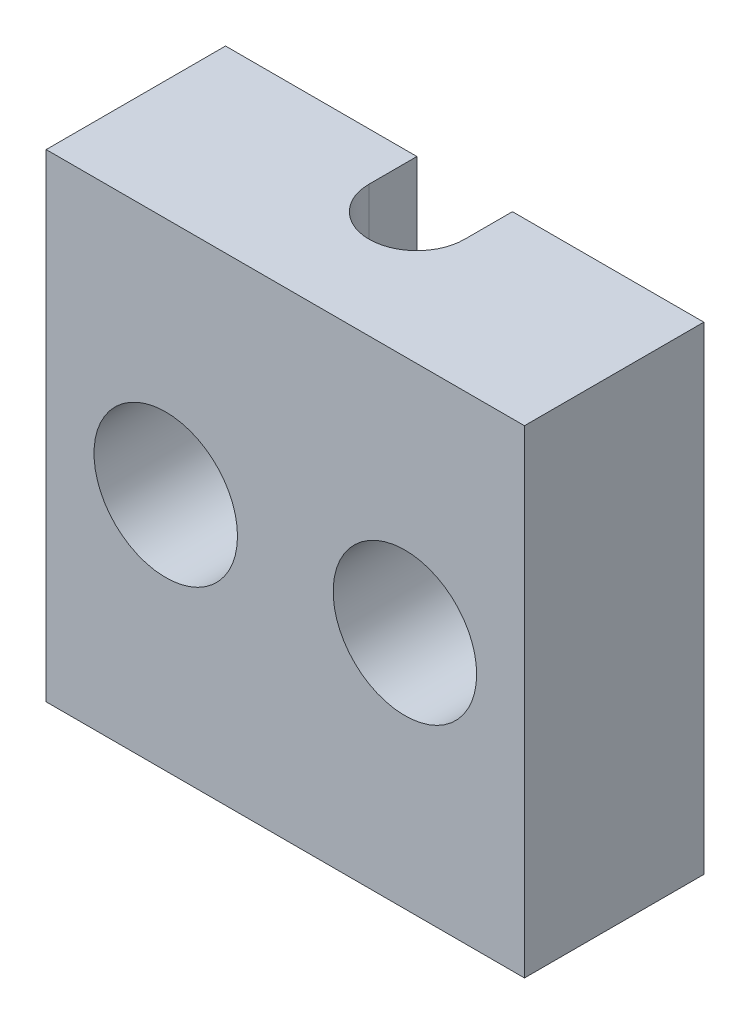
ISO-10303-21;
HEADER;
FILE_DESCRIPTION(('STEP AP214'),'2;1');
FILE_NAME('part.step','',(''),(''),'','','');
FILE_SCHEMA(('AUTOMOTIVE_DESIGN { 1 0 10303 214 1 1 1 1 }'));
ENDSEC;
DATA;
#1=APPLICATION_CONTEXT('core data for automotive mechanical design processes');
#2=APPLICATION_PROTOCOL_DEFINITION('international standard','automotive_design',2000,#1);
#3=PRODUCT_CONTEXT('',#1,'mechanical');
#4=PRODUCT('Part','Part','',(#3));
#5=PRODUCT_RELATED_PRODUCT_CATEGORY('part','',(#4));
#6=PRODUCT_DEFINITION_FORMATION('','',#4);
#7=PRODUCT_DEFINITION_CONTEXT('part definition',#1,'design');
#8=PRODUCT_DEFINITION('design','',#6,#7);
#9=PRODUCT_DEFINITION_SHAPE('','',#8);
#10=(LENGTH_UNIT() NAMED_UNIT(*) SI_UNIT(.MILLI.,.METRE.));
#11=(NAMED_UNIT(*) PLANE_ANGLE_UNIT() SI_UNIT($,.RADIAN.));
#12=(NAMED_UNIT(*) SI_UNIT($,.STERADIAN.) SOLID_ANGLE_UNIT());
#13=UNCERTAINTY_MEASURE_WITH_UNIT(LENGTH_MEASURE(1.E-05),#10,'distance_accuracy_value','');
#14=(GEOMETRIC_REPRESENTATION_CONTEXT(3) GLOBAL_UNCERTAINTY_ASSIGNED_CONTEXT((#13)) GLOBAL_UNIT_ASSIGNED_CONTEXT((#10,
#11,#12)) REPRESENTATION_CONTEXT('',''));
#15=CARTESIAN_POINT('',(0.,0.,0.));
#16=DIRECTION('',(0.,0.,1.));
#17=DIRECTION('',(1.,0.,0.));
#18=AXIS2_PLACEMENT_3D('',#15,#16,#17);
#19=CARTESIAN_POINT('',(-5.08,5.08,3.81));
#20=DIRECTION('',(0.,-1.,0.));
#21=DIRECTION('',(0.,0.,-1.));
#22=AXIS2_PLACEMENT_3D('',#19,#20,#21);
#23=PLANE('',#22);
#24=DIRECTION('',(0.,0.,1.));
#25=VECTOR('',#24,1.);
#26=CARTESIAN_POINT('',(1.01473,5.08,0.));
#27=LINE('',#26,#25);
#28=CARTESIAN_POINT('',(1.01473,5.08,0.));
#29=VERTEX_POINT('',#28);
#30=CARTESIAN_POINT('',(1.01473,5.08,1.016));
#31=VERTEX_POINT('',#30);
#32=EDGE_CURVE('E137',#29,#31,#27,.T.);
#33=ORIENTED_EDGE('',*,*,#32,.T.);
#34=CARTESIAN_POINT('',(0.,5.08,1.016));
#35=DIRECTION('',(0.,-1.,0.));
#36=DIRECTION('',(0.,0.,-1.));
#37=AXIS2_PLACEMENT_3D('',#34,#35,#36);
#38=CIRCLE('',#37,1.01473);
#39=CARTESIAN_POINT('',(-1.01473,5.08,1.016));
#40=VERTEX_POINT('',#39);
#41=EDGE_CURVE('E114',#40,#31,#38,.F.);
#42=ORIENTED_EDGE('',*,*,#41,.F.);
#43=DIRECTION('',(0.,0.,1.));
#44=VECTOR('',#43,1.);
#45=CARTESIAN_POINT('',(-1.01473,5.08,0.));
#46=LINE('',#45,#44);
#47=CARTESIAN_POINT('',(-1.01473,5.08,0.));
#48=VERTEX_POINT('',#47);
#49=EDGE_CURVE('E131',#48,#40,#46,.T.);
#50=ORIENTED_EDGE('',*,*,#49,.F.);
#51=DIRECTION('',(-1.,0.,0.));
#52=VECTOR('',#51,1.);
#53=CARTESIAN_POINT('',(-5.08,5.08,0.));
#54=LINE('',#53,#52);
#55=CARTESIAN_POINT('',(-5.08,5.08,0.));
#56=VERTEX_POINT('',#55);
#57=EDGE_CURVE('E160',#48,#56,#54,.T.);
#58=ORIENTED_EDGE('',*,*,#57,.T.);
#59=DIRECTION('',(0.,0.,-1.));
#60=VECTOR('',#59,1.);
#61=CARTESIAN_POINT('',(-5.08,5.08,3.81));
#62=LINE('',#61,#60);
#63=CARTESIAN_POINT('',(-5.08,5.08,3.81));
#64=VERTEX_POINT('',#63);
#65=EDGE_CURVE('E41',#64,#56,#62,.T.);
#66=ORIENTED_EDGE('',*,*,#65,.F.);
#67=DIRECTION('',(-1.,0.,0.));
#68=VECTOR('',#67,1.);
#69=CARTESIAN_POINT('',(-5.08,5.08,3.81));
#70=LINE('',#69,#68);
#71=CARTESIAN_POINT('',(5.08,5.08,3.81));
#72=VERTEX_POINT('',#71);
#73=EDGE_CURVE('E85',#72,#64,#70,.T.);
#74=ORIENTED_EDGE('',*,*,#73,.F.);
#75=DIRECTION('',(0.,0.,-1.));
#76=VECTOR('',#75,1.);
#77=CARTESIAN_POINT('',(5.08,5.08,3.81));
#78=LINE('',#77,#76);
#79=CARTESIAN_POINT('',(5.08,5.08,0.));
#80=VERTEX_POINT('',#79);
#81=EDGE_CURVE('E11',#72,#80,#78,.T.);
#82=ORIENTED_EDGE('',*,*,#81,.T.);
#83=EDGE_CURVE('E161',#80,#29,#54,.T.);
#84=ORIENTED_EDGE('',*,*,#83,.T.);
#85=EDGE_LOOP('',(#33,#42,#50,#58,#66,#74,#82,#84));
#86=FACE_BOUND('',#85,.T.);
#87=ADVANCED_FACE('F33',(#86),#23,.F.);
#88=CARTESIAN_POINT('',(-5.08,-5.08,3.81));
#89=DIRECTION('',(0.,1.,0.));
#90=DIRECTION('',(0.,0.,1.));
#91=AXIS2_PLACEMENT_3D('',#88,#89,#90);
#92=PLANE('',#91);
#93=DIRECTION('',(0.,0.,-1.));
#94=VECTOR('',#93,1.);
#95=CARTESIAN_POINT('',(1.01473,-5.08,0.));
#96=LINE('',#95,#94);
#97=CARTESIAN_POINT('',(1.01473,-5.08,1.016));
#98=VERTEX_POINT('',#97);
#99=CARTESIAN_POINT('',(1.01473,-5.08,0.));
#100=VERTEX_POINT('',#99);
#101=EDGE_CURVE('E119',#98,#100,#96,.T.);
#102=ORIENTED_EDGE('',*,*,#101,.T.);
#103=DIRECTION('',(1.,0.,0.));
#104=VECTOR('',#103,1.);
#105=CARTESIAN_POINT('',(-5.08,-5.08,0.));
#106=LINE('',#105,#104);
#107=CARTESIAN_POINT('',(5.08,-5.08,0.));
#108=VERTEX_POINT('',#107);
#109=EDGE_CURVE('E78',#100,#108,#106,.T.);
#110=ORIENTED_EDGE('',*,*,#109,.T.);
#111=DIRECTION('',(0.,0.,-1.));
#112=VECTOR('',#111,1.);
#113=CARTESIAN_POINT('',(5.08,-5.08,3.81));
#114=LINE('',#113,#112);
#115=CARTESIAN_POINT('',(5.08,-5.08,3.81));
#116=VERTEX_POINT('',#115);
#117=EDGE_CURVE('E157',#116,#108,#114,.T.);
#118=ORIENTED_EDGE('',*,*,#117,.F.);
#119=DIRECTION('',(1.,0.,0.));
#120=VECTOR('',#119,1.);
#121=CARTESIAN_POINT('',(-5.08,-5.08,3.81));
#122=LINE('',#121,#120);
#123=CARTESIAN_POINT('',(-5.08,-5.08,3.81));
#124=VERTEX_POINT('',#123);
#125=EDGE_CURVE('E57',#124,#116,#122,.T.);
#126=ORIENTED_EDGE('',*,*,#125,.F.);
#127=DIRECTION('',(0.,0.,-1.));
#128=VECTOR('',#127,1.);
#129=CARTESIAN_POINT('',(-5.08,-5.08,3.81));
#130=LINE('',#129,#128);
#131=CARTESIAN_POINT('',(-5.08,-5.08,0.));
#132=VERTEX_POINT('',#131);
#133=EDGE_CURVE('E168',#124,#132,#130,.T.);
#134=ORIENTED_EDGE('',*,*,#133,.T.);
#135=CARTESIAN_POINT('',(-1.01473,-5.08,0.));
#136=VERTEX_POINT('',#135);
#137=EDGE_CURVE('E152',#132,#136,#106,.T.);
#138=ORIENTED_EDGE('',*,*,#137,.T.);
#139=DIRECTION('',(0.,0.,-1.));
#140=VECTOR('',#139,1.);
#141=CARTESIAN_POINT('',(-1.01473,-5.08,0.));
#142=LINE('',#141,#140);
#143=CARTESIAN_POINT('',(-1.01473,-5.08,1.016));
#144=VERTEX_POINT('',#143);
#145=EDGE_CURVE('E48',#144,#136,#142,.T.);
#146=ORIENTED_EDGE('',*,*,#145,.F.);
#147=CARTESIAN_POINT('',(0.,-5.08,1.016));
#148=DIRECTION('',(0.,-1.,0.));
#149=DIRECTION('',(0.,0.,-1.));
#150=AXIS2_PLACEMENT_3D('',#147,#148,#149);
#151=CIRCLE('',#150,1.01473);
#152=EDGE_CURVE('E112',#98,#144,#151,.T.);
#153=ORIENTED_EDGE('',*,*,#152,.F.);
#154=EDGE_LOOP('',(#102,#110,#118,#126,#134,#138,#146,#153));
#155=FACE_BOUND('',#154,.T.);
#156=ADVANCED_FACE('F124',(#155),#92,.F.);
#157=CARTESIAN_POINT('',(0.,0.,0.));
#158=DIRECTION('',(0.,0.,1.));
#159=DIRECTION('',(1.,0.,0.));
#160=AXIS2_PLACEMENT_3D('',#157,#158,#159);
#161=PLANE('',#160);
#162=CARTESIAN_POINT('',(2.54,0.,0.));
#163=DIRECTION('',(0.,0.,1.));
#164=DIRECTION('',(1.,0.,0.));
#165=AXIS2_PLACEMENT_3D('',#162,#163,#164);
#166=CIRCLE('',#165,1.524);
#167=CARTESIAN_POINT('',(4.064,0.,0.));
#168=VERTEX_POINT('',#167);
#169=EDGE_CURVE('E146',#168,#168,#166,.F.);
#170=ORIENTED_EDGE('',*,*,#169,.F.);
#171=EDGE_LOOP('',(#170));
#172=FACE_BOUND('',#171,.T.);
#173=DIRECTION('',(0.,-1.,0.));
#174=VECTOR('',#173,1.);
#175=CARTESIAN_POINT('',(1.01473,7.95098802235397,0.));
#176=LINE('',#175,#174);
#177=EDGE_CURVE('E122',#29,#100,#176,.T.);
#178=ORIENTED_EDGE('',*,*,#177,.F.);
#179=ORIENTED_EDGE('',*,*,#83,.F.);
#180=DIRECTION('',(0.,1.,0.));
#181=VECTOR('',#180,1.);
#182=CARTESIAN_POINT('',(5.08,5.08,0.));
#183=LINE('',#182,#181);
#184=EDGE_CURVE('E149',#108,#80,#183,.T.);
#185=ORIENTED_EDGE('',*,*,#184,.F.);
#186=ORIENTED_EDGE('',*,*,#109,.F.);
#187=EDGE_LOOP('',(#178,#179,#185,#186));
#188=FACE_BOUND('',#187,.T.);
#189=ADVANCED_FACE('F195',(#172,#188),#161,.F.);
#190=CARTESIAN_POINT('',(5.08,5.08,3.81));
#191=DIRECTION('',(-1.,0.,0.));
#192=DIRECTION('',(0.,0.,1.));
#193=AXIS2_PLACEMENT_3D('',#190,#191,#192);
#194=PLANE('',#193);
#195=ORIENTED_EDGE('',*,*,#184,.T.);
#196=ORIENTED_EDGE('',*,*,#81,.F.);
#197=DIRECTION('',(0.,1.,0.));
#198=VECTOR('',#197,1.);
#199=CARTESIAN_POINT('',(5.08,5.08,3.81));
#200=LINE('',#199,#198);
#201=EDGE_CURVE('E150',#116,#72,#200,.T.);
#202=ORIENTED_EDGE('',*,*,#201,.F.);
#203=ORIENTED_EDGE('',*,*,#117,.T.);
#204=EDGE_LOOP('',(#195,#196,#202,#203));
#205=FACE_BOUND('',#204,.T.);
#206=ADVANCED_FACE('F35',(#205),#194,.F.);
#207=CARTESIAN_POINT('',(-5.08,5.08,3.81));
#208=DIRECTION('',(1.,0.,0.));
#209=DIRECTION('',(0.,1.,0.));
#210=AXIS2_PLACEMENT_3D('',#207,#208,#209);
#211=PLANE('',#210);
#212=DIRECTION('',(0.,-1.,0.));
#213=VECTOR('',#212,1.);
#214=CARTESIAN_POINT('',(-5.08,5.08,0.));
#215=LINE('',#214,#213);
#216=EDGE_CURVE('E164',#56,#132,#215,.T.);
#217=ORIENTED_EDGE('',*,*,#216,.T.);
#218=ORIENTED_EDGE('',*,*,#133,.F.);
#219=DIRECTION('',(0.,-1.,0.));
#220=VECTOR('',#219,1.);
#221=CARTESIAN_POINT('',(-5.08,5.08,3.81));
#222=LINE('',#221,#220);
#223=EDGE_CURVE('E154',#64,#124,#222,.T.);
#224=ORIENTED_EDGE('',*,*,#223,.F.);
#225=ORIENTED_EDGE('',*,*,#65,.T.);
#226=EDGE_LOOP('',(#217,#218,#224,#225));
#227=FACE_BOUND('',#226,.T.);
#228=ADVANCED_FACE('F174',(#227),#211,.F.);
#229=CARTESIAN_POINT('',(0.,0.,3.81));
#230=DIRECTION('',(0.,0.,1.));
#231=DIRECTION('',(1.,0.,0.));
#232=AXIS2_PLACEMENT_3D('',#229,#230,#231);
#233=PLANE('',#232);
#234=CARTESIAN_POINT('',(-2.54,0.,3.81));
#235=DIRECTION('',(0.,0.,1.));
#236=DIRECTION('',(1.,0.,0.));
#237=AXIS2_PLACEMENT_3D('',#234,#235,#236);
#238=CIRCLE('',#237,1.524);
#239=CARTESIAN_POINT('',(-1.016,0.,3.81));
#240=VERTEX_POINT('',#239);
#241=EDGE_CURVE('E136',#240,#240,#238,.T.);
#242=ORIENTED_EDGE('',*,*,#241,.F.);
#243=EDGE_LOOP('',(#242));
#244=FACE_BOUND('',#243,.T.);
#245=CARTESIAN_POINT('',(2.54,0.,3.81));
#246=DIRECTION('',(0.,0.,1.));
#247=DIRECTION('',(1.,0.,0.));
#248=AXIS2_PLACEMENT_3D('',#245,#246,#247);
#249=CIRCLE('',#248,1.524);
#250=CARTESIAN_POINT('',(4.064,0.,3.81));
#251=VERTEX_POINT('',#250);
#252=EDGE_CURVE('E143',#251,#251,#249,.T.);
#253=ORIENTED_EDGE('',*,*,#252,.F.);
#254=EDGE_LOOP('',(#253));
#255=FACE_BOUND('',#254,.T.);
#256=ORIENTED_EDGE('',*,*,#201,.T.);
#257=ORIENTED_EDGE('',*,*,#73,.T.);
#258=ORIENTED_EDGE('',*,*,#223,.T.);
#259=ORIENTED_EDGE('',*,*,#125,.T.);
#260=EDGE_LOOP('',(#256,#257,#258,#259));
#261=FACE_BOUND('',#260,.T.);
#262=ADVANCED_FACE('F184',(#244,#255,#261),#233,.T.);
#263=CARTESIAN_POINT('',(-2.54,0.,0.));
#264=DIRECTION('',(0.,0.,1.));
#265=DIRECTION('',(1.,0.,0.));
#266=AXIS2_PLACEMENT_3D('',#263,#264,#265);
#267=CIRCLE('',#266,1.524);
#268=CARTESIAN_POINT('',(-1.016,0.,0.));
#269=VERTEX_POINT('',#268);
#270=EDGE_CURVE('E140',#269,#269,#267,.F.);
#271=ORIENTED_EDGE('',*,*,#270,.F.);
#272=EDGE_LOOP('',(#271));
#273=FACE_BOUND('',#272,.T.);
#274=ORIENTED_EDGE('',*,*,#57,.F.);
#275=DIRECTION('',(0.,-1.,0.));
#276=VECTOR('',#275,1.);
#277=CARTESIAN_POINT('',(-1.01473,7.95098802235397,0.));
#278=LINE('',#277,#276);
#279=EDGE_CURVE('E132',#48,#136,#278,.T.);
#280=ORIENTED_EDGE('',*,*,#279,.T.);
#281=ORIENTED_EDGE('',*,*,#137,.F.);
#282=ORIENTED_EDGE('',*,*,#216,.F.);
#283=EDGE_LOOP('',(#274,#280,#281,#282));
#284=FACE_BOUND('',#283,.T.);
#285=ADVANCED_FACE('F179',(#273,#284),#161,.F.);
#286=CARTESIAN_POINT('',(2.54,0.,-4.3105229381132));
#287=DIRECTION('',(0.,0.,1.));
#288=DIRECTION('',(1.,0.,0.));
#289=AXIS2_PLACEMENT_3D('',#286,#287,#288);
#290=CYLINDRICAL_SURFACE('',#289,1.524);
#291=ORIENTED_EDGE('',*,*,#169,.T.);
#292=EDGE_LOOP('',(#291));
#293=FACE_BOUND('',#292,.T.);
#294=ORIENTED_EDGE('',*,*,#252,.T.);
#295=EDGE_LOOP('',(#294));
#296=FACE_BOUND('',#295,.T.);
#297=ADVANCED_FACE('F192',(#293,#296),#290,.F.);
#298=CARTESIAN_POINT('',(-2.54,0.,-4.3105229381132));
#299=DIRECTION('',(0.,0.,1.));
#300=DIRECTION('',(1.,0.,0.));
#301=AXIS2_PLACEMENT_3D('',#298,#299,#300);
#302=CYLINDRICAL_SURFACE('',#301,1.524);
#303=ORIENTED_EDGE('',*,*,#270,.T.);
#304=EDGE_LOOP('',(#303));
#305=FACE_BOUND('',#304,.T.);
#306=ORIENTED_EDGE('',*,*,#241,.T.);
#307=EDGE_LOOP('',(#306));
#308=FACE_BOUND('',#307,.T.);
#309=ADVANCED_FACE('F215',(#305,#308),#302,.F.);
#310=CARTESIAN_POINT('',(1.01473,7.95098802235397,0.));
#311=DIRECTION('',(-1.,0.,0.));
#312=DIRECTION('',(0.,0.,1.));
#313=AXIS2_PLACEMENT_3D('',#310,#311,#312);
#314=PLANE('',#313);
#315=ORIENTED_EDGE('',*,*,#177,.T.);
#316=ORIENTED_EDGE('',*,*,#101,.F.);
#317=DIRECTION('',(0.,-1.,0.));
#318=VECTOR('',#317,1.);
#319=CARTESIAN_POINT('',(1.01473,7.95098802235397,1.016));
#320=LINE('',#319,#318);
#321=EDGE_CURVE('E107',#31,#98,#320,.T.);
#322=ORIENTED_EDGE('',*,*,#321,.F.);
#323=ORIENTED_EDGE('',*,*,#32,.F.);
#324=EDGE_LOOP('',(#315,#316,#322,#323));
#325=FACE_BOUND('',#324,.T.);
#326=ADVANCED_FACE('F120',(#325),#314,.T.);
#327=CARTESIAN_POINT('',(-1.01473,7.95098802235397,0.));
#328=DIRECTION('',(-1.,0.,0.));
#329=DIRECTION('',(0.,0.,1.));
#330=AXIS2_PLACEMENT_3D('',#327,#328,#329);
#331=PLANE('',#330);
#332=ORIENTED_EDGE('',*,*,#49,.T.);
#333=DIRECTION('',(0.,-1.,0.));
#334=VECTOR('',#333,1.);
#335=CARTESIAN_POINT('',(-1.01473,7.95098802235397,1.016));
#336=LINE('',#335,#334);
#337=EDGE_CURVE('E117',#40,#144,#336,.T.);
#338=ORIENTED_EDGE('',*,*,#337,.T.);
#339=ORIENTED_EDGE('',*,*,#145,.T.);
#340=ORIENTED_EDGE('',*,*,#279,.F.);
#341=EDGE_LOOP('',(#332,#338,#339,#340));
#342=FACE_BOUND('',#341,.T.);
#343=ADVANCED_FACE('F207',(#342),#331,.F.);
#344=CARTESIAN_POINT('',(0.,7.95098802235397,1.016));
#345=DIRECTION('',(0.,-1.,0.));
#346=DIRECTION('',(0.,0.,-1.));
#347=AXIS2_PLACEMENT_3D('',#344,#345,#346);
#348=CYLINDRICAL_SURFACE('',#347,1.01473);
#349=ORIENTED_EDGE('',*,*,#41,.T.);
#350=ORIENTED_EDGE('',*,*,#321,.T.);
#351=ORIENTED_EDGE('',*,*,#152,.T.);
#352=ORIENTED_EDGE('',*,*,#337,.F.);
#353=EDGE_LOOP('',(#349,#350,#351,#352));
#354=FACE_BOUND('',#353,.T.);
#355=ADVANCED_FACE('F109',(#354),#348,.F.);
#356=CLOSED_SHELL('',(#87,#156,#189,#206,#228,#262,#285,#297,#309,#326,#343,#355));
#357=MANIFOLD_SOLID_BREP('B2',#356);
#358=ADVANCED_BREP_SHAPE_REPRESENTATION('',(#18,#357),#14);
#359=SHAPE_DEFINITION_REPRESENTATION(#9,#358);
ENDSEC;
END-ISO-10303-21;
